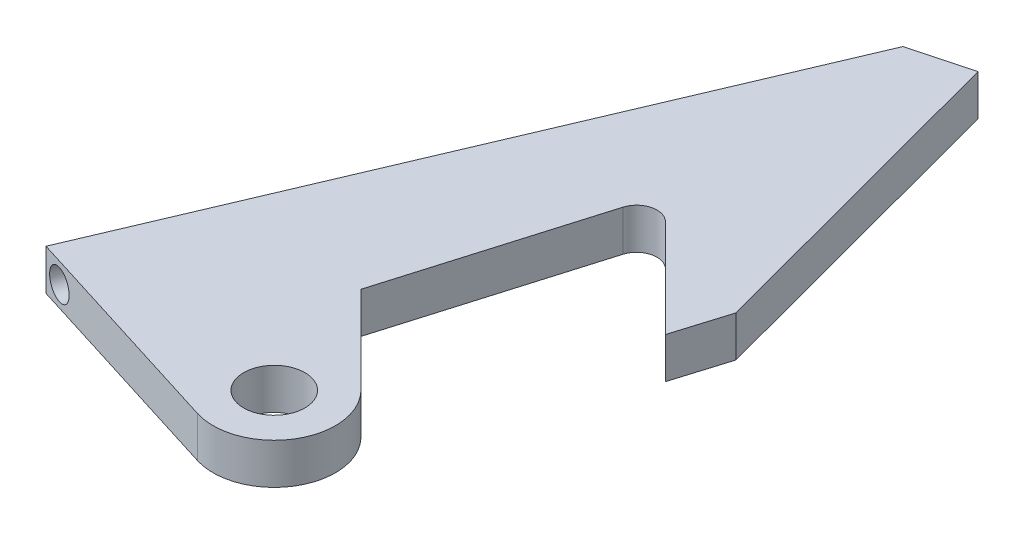
ISO-10303-21;
HEADER;
FILE_DESCRIPTION(('STEP AP214'),'2;1');
FILE_NAME('part.step','',(''),(''),'','','');
FILE_SCHEMA(('AUTOMOTIVE_DESIGN { 1 0 10303 214 1 1 1 1 }'));
ENDSEC;
DATA;
#1=APPLICATION_CONTEXT('core data for automotive mechanical design processes');
#2=APPLICATION_PROTOCOL_DEFINITION('international standard','automotive_design',2000,#1);
#3=PRODUCT_CONTEXT('',#1,'mechanical');
#4=PRODUCT('Part','Part','',(#3));
#5=PRODUCT_RELATED_PRODUCT_CATEGORY('part','',(#4));
#6=PRODUCT_DEFINITION_FORMATION('','',#4);
#7=PRODUCT_DEFINITION_CONTEXT('part definition',#1,'design');
#8=PRODUCT_DEFINITION('design','',#6,#7);
#9=PRODUCT_DEFINITION_SHAPE('','',#8);
#10=(LENGTH_UNIT() NAMED_UNIT(*) SI_UNIT(.MILLI.,.METRE.));
#11=(NAMED_UNIT(*) PLANE_ANGLE_UNIT() SI_UNIT($,.RADIAN.));
#12=(NAMED_UNIT(*) SI_UNIT($,.STERADIAN.) SOLID_ANGLE_UNIT());
#13=UNCERTAINTY_MEASURE_WITH_UNIT(LENGTH_MEASURE(1.E-05),#10,'distance_accuracy_value','');
#14=(GEOMETRIC_REPRESENTATION_CONTEXT(3) GLOBAL_UNCERTAINTY_ASSIGNED_CONTEXT((#13)) GLOBAL_UNIT_ASSIGNED_CONTEXT((#10,
#11,#12)) REPRESENTATION_CONTEXT('',''));
#15=CARTESIAN_POINT('',(0.,0.,0.));
#16=DIRECTION('',(0.,0.,1.));
#17=DIRECTION('',(1.,0.,0.));
#18=AXIS2_PLACEMENT_3D('',#15,#16,#17);
#19=CARTESIAN_POINT('',(-9.58336148505084,6.35,57.0523987186824));
#20=DIRECTION('',(0.,1.,0.));
#21=DIRECTION('',(0.,0.,1.));
#22=AXIS2_PLACEMENT_3D('',#19,#20,#21);
#23=PLANE('',#22);
#24=DIRECTION('',(0.292719197910584,0.,-0.956198447590553));
#25=VECTOR('',#24,1.);
#26=CARTESIAN_POINT('',(13.3155738088918,6.35,19.1289332993239));
#27=LINE('',#26,#25);
#28=CARTESIAN_POINT('',(13.3155738088918,6.35,19.1289332993239));
#29=VERTEX_POINT('',#28);
#30=CARTESIAN_POINT('',(15.8794716912915,6.35,10.7536876972908));
#31=VERTEX_POINT('',#30);
#32=EDGE_CURVE('E168',#29,#31,#27,.T.);
#33=ORIENTED_EDGE('',*,*,#32,.T.);
#34=DIRECTION('',(-0.25723629660689,0.,-0.96634853324666));
#35=VECTOR('',#34,1.);
#36=CARTESIAN_POINT('',(15.8794716912915,6.35,10.7536876972908));
#37=LINE('',#36,#35);
#38=CARTESIAN_POINT('',(2.2197595002291,6.35,-40.5611656671901));
#39=VERTEX_POINT('',#38);
#40=EDGE_CURVE('E105',#31,#39,#37,.T.);
#41=ORIENTED_EDGE('',*,*,#40,.T.);
#42=DIRECTION('',(-0.96634853324666,0.,0.257236296606892));
#43=VECTOR('',#42,1.);
#44=CARTESIAN_POINT('',(-6.99422582657964,6.35,-38.1084569591886));
#45=LINE('',#44,#43);
#46=CARTESIAN_POINT('',(-6.99422582657964,6.35,-38.1084569591886));
#47=VERTEX_POINT('',#46);
#48=EDGE_CURVE('E189',#39,#47,#45,.T.);
#49=ORIENTED_EDGE('',*,*,#48,.T.);
#50=DIRECTION('',(-0.391080688495198,0.,0.920356395689258));
#51=VECTOR('',#50,1.);
#52=CARTESIAN_POINT('',(-46.7280237776918,6.35,55.39975284284));
#53=LINE('',#52,#51);
#54=CARTESIAN_POINT('',(-46.7280237776918,6.35,55.39975284284));
#55=VERTEX_POINT('',#54);
#56=EDGE_CURVE('E208',#47,#55,#53,.T.);
#57=ORIENTED_EDGE('',*,*,#56,.T.);
#58=DIRECTION('',(0.954289276042193,0.,0.298884555691437));
#59=VECTOR('',#58,1.);
#60=CARTESIAN_POINT('',(-12.3815604695126,6.35,66.1571067010044));
#61=LINE('',#60,#59);
#62=CARTESIAN_POINT('',(-12.3815604695126,6.35,66.1571067010044));
#63=VERTEX_POINT('',#62);
#64=EDGE_CURVE('E205',#55,#63,#61,.T.);
#65=ORIENTED_EDGE('',*,*,#64,.T.);
#66=CARTESIAN_POINT('',(-9.58336148505084,6.35,57.0523987186824));
#67=DIRECTION('',(0.,1.,0.));
#68=DIRECTION('',(0.,0.,1.));
#69=AXIS2_PLACEMENT_3D('',#66,#67,#68);
#70=CIRCLE('',#69,9.525);
#71=CARTESIAN_POINT('',(-2.71547260344062,6.35,50.4525708944241));
#72=VERTEX_POINT('',#71);
#73=EDGE_CURVE('E207',#63,#72,#70,.T.);
#74=ORIENTED_EDGE('',*,*,#73,.T.);
#75=DIRECTION('',(-0.707038114572614,0.,-0.707175441132964));
#76=VECTOR('',#75,1.);
#77=CARTESIAN_POINT('',(-2.71547260344062,6.35,50.4525708944241));
#78=LINE('',#77,#76);
#79=CARTESIAN_POINT('',(-16.4492107059134,6.35,36.7161653162162));
#80=VERTEX_POINT('',#79);
#81=EDGE_CURVE('E131',#72,#80,#78,.T.);
#82=ORIENTED_EDGE('',*,*,#81,.T.);
#83=DIRECTION('',(0.284015344703923,0.,-0.958819734868193));
#84=VECTOR('',#83,1.);
#85=CARTESIAN_POINT('',(-7.14392939853329,6.35,5.30206209120496));
#86=LINE('',#85,#84);
#87=CARTESIAN_POINT('',(-7.14392939853329,6.35,5.30206209120496));
#88=VERTEX_POINT('',#87);
#89=EDGE_CURVE('E125',#80,#88,#86,.T.);
#90=ORIENTED_EDGE('',*,*,#89,.T.);
#91=CARTESIAN_POINT('',(-4.09967674032677,6.35,6.20381081063987));
#92=DIRECTION('',(0.,-1.,0.));
#93=DIRECTION('',(0.,0.,1.));
#94=AXIS2_PLACEMENT_3D('',#91,#92,#93);
#95=CIRCLE('',#94,3.175);
#96=CARTESIAN_POINT('',(-1.85461271005945,6.35,3.95874678037261));
#97=VERTEX_POINT('',#96);
#98=EDGE_CURVE('E129',#88,#97,#95,.T.);
#99=ORIENTED_EDGE('',*,*,#98,.T.);
#100=DIRECTION('',(0.707106781186547,0.,0.707106781186548));
#101=VECTOR('',#100,1.);
#102=CARTESIAN_POINT('',(13.3155738088918,6.35,19.1289332993239));
#103=LINE('',#102,#101);
#104=EDGE_CURVE('E55',#97,#29,#103,.T.);
#105=ORIENTED_EDGE('',*,*,#104,.T.);
#106=EDGE_LOOP('',(#33,#41,#49,#57,#65,#74,#82,#90,#99,#105));
#107=FACE_BOUND('',#106,.T.);
#108=CARTESIAN_POINT('',(-9.58336148505084,6.35,57.0523987186824));
#109=DIRECTION('',(0.,1.,0.));
#110=DIRECTION('',(0.,0.,1.));
#111=AXIS2_PLACEMENT_3D('',#108,#109,#110);
#112=CIRCLE('',#111,4.7625);
#113=CARTESIAN_POINT('',(-9.58336148505084,6.35,61.8148987186824));
#114=VERTEX_POINT('',#113);
#115=EDGE_CURVE('E153',#114,#114,#112,.T.);
#116=ORIENTED_EDGE('',*,*,#115,.F.);
#117=EDGE_LOOP('',(#116));
#118=FACE_BOUND('',#117,.T.);
#119=ADVANCED_FACE('F38',(#107,#118),#23,.T.);
#120=CARTESIAN_POINT('',(-9.58336148505084,0.,57.0523987186824));
#121=DIRECTION('',(0.,1.,0.));
#122=DIRECTION('',(0.,0.,1.));
#123=AXIS2_PLACEMENT_3D('',#120,#121,#122);
#124=PLANE('',#123);
#125=DIRECTION('',(0.292719197910584,0.,-0.956198447590553));
#126=VECTOR('',#125,1.);
#127=CARTESIAN_POINT('',(13.3155738088918,0.,19.1289332993239));
#128=LINE('',#127,#126);
#129=CARTESIAN_POINT('',(13.3155738088918,0.,19.1289332993239));
#130=VERTEX_POINT('',#129);
#131=CARTESIAN_POINT('',(15.8794716912915,0.,10.7536876972908));
#132=VERTEX_POINT('',#131);
#133=EDGE_CURVE('E149',#130,#132,#128,.T.);
#134=ORIENTED_EDGE('',*,*,#133,.F.);
#135=DIRECTION('',(0.707106781186547,0.,0.707106781186548));
#136=VECTOR('',#135,1.);
#137=CARTESIAN_POINT('',(13.3155738088918,0.,19.1289332993239));
#138=LINE('',#137,#136);
#139=CARTESIAN_POINT('',(-1.85461271005945,0.,3.95874678037261));
#140=VERTEX_POINT('',#139);
#141=EDGE_CURVE('E97',#140,#130,#138,.T.);
#142=ORIENTED_EDGE('',*,*,#141,.F.);
#143=CARTESIAN_POINT('',(-4.09967674032677,0.,6.20381081063987));
#144=DIRECTION('',(0.,-1.,0.));
#145=DIRECTION('',(0.,0.,1.));
#146=AXIS2_PLACEMENT_3D('',#143,#144,#145);
#147=CIRCLE('',#146,3.175);
#148=CARTESIAN_POINT('',(-7.14392939853329,0.,5.30206209120496));
#149=VERTEX_POINT('',#148);
#150=EDGE_CURVE('E91',#149,#140,#147,.T.);
#151=ORIENTED_EDGE('',*,*,#150,.F.);
#152=DIRECTION('',(0.284015344703923,0.,-0.958819734868193));
#153=VECTOR('',#152,1.);
#154=CARTESIAN_POINT('',(-7.14392939853329,0.,5.30206209120496));
#155=LINE('',#154,#153);
#156=CARTESIAN_POINT('',(-16.4492107059134,0.,36.7161653162162));
#157=VERTEX_POINT('',#156);
#158=EDGE_CURVE('E139',#157,#149,#155,.T.);
#159=ORIENTED_EDGE('',*,*,#158,.F.);
#160=DIRECTION('',(-0.707038114572614,0.,-0.707175441132964));
#161=VECTOR('',#160,1.);
#162=CARTESIAN_POINT('',(-2.71547260344062,0.,50.4525708944241));
#163=LINE('',#162,#161);
#164=CARTESIAN_POINT('',(-2.71547260344062,0.,50.4525708944241));
#165=VERTEX_POINT('',#164);
#166=EDGE_CURVE('E163',#165,#157,#163,.T.);
#167=ORIENTED_EDGE('',*,*,#166,.F.);
#168=CARTESIAN_POINT('',(-9.58336148505084,0.,57.0523987186824));
#169=DIRECTION('',(0.,1.,0.));
#170=DIRECTION('',(0.,0.,1.));
#171=AXIS2_PLACEMENT_3D('',#168,#169,#170);
#172=CIRCLE('',#171,9.525);
#173=CARTESIAN_POINT('',(-12.3815604695126,0.,66.1571067010044));
#174=VERTEX_POINT('',#173);
#175=EDGE_CURVE('E161',#174,#165,#172,.T.);
#176=ORIENTED_EDGE('',*,*,#175,.F.);
#177=DIRECTION('',(0.954289276042193,0.,0.298884555691437));
#178=VECTOR('',#177,1.);
#179=CARTESIAN_POINT('',(-12.3815604695126,0.,66.1571067010044));
#180=LINE('',#179,#178);
#181=CARTESIAN_POINT('',(-46.7280237776918,0.,55.39975284284));
#182=VERTEX_POINT('',#181);
#183=EDGE_CURVE('E159',#182,#174,#180,.T.);
#184=ORIENTED_EDGE('',*,*,#183,.F.);
#185=DIRECTION('',(-0.391080688495198,0.,0.920356395689258));
#186=VECTOR('',#185,1.);
#187=CARTESIAN_POINT('',(-46.7280237776918,0.,55.39975284284));
#188=LINE('',#187,#186);
#189=CARTESIAN_POINT('',(-6.99422582657964,0.,-38.1084569591886));
#190=VERTEX_POINT('',#189);
#191=EDGE_CURVE('E157',#190,#182,#188,.T.);
#192=ORIENTED_EDGE('',*,*,#191,.F.);
#193=DIRECTION('',(-0.96634853324666,0.,0.257236296606892));
#194=VECTOR('',#193,1.);
#195=CARTESIAN_POINT('',(-6.99422582657964,0.,-38.1084569591886));
#196=LINE('',#195,#194);
#197=CARTESIAN_POINT('',(2.2197595002291,0.,-40.5611656671901));
#198=VERTEX_POINT('',#197);
#199=EDGE_CURVE('E155',#198,#190,#196,.T.);
#200=ORIENTED_EDGE('',*,*,#199,.F.);
#201=DIRECTION('',(-0.25723629660689,0.,-0.96634853324666));
#202=VECTOR('',#201,1.);
#203=CARTESIAN_POINT('',(15.8794716912915,0.,10.7536876972908));
#204=LINE('',#203,#202);
#205=EDGE_CURVE('E152',#132,#198,#204,.T.);
#206=ORIENTED_EDGE('',*,*,#205,.F.);
#207=EDGE_LOOP('',(#134,#142,#151,#159,#167,#176,#184,#192,#200,#206));
#208=FACE_BOUND('',#207,.T.);
#209=CARTESIAN_POINT('',(-9.58336148505084,0.,57.0523987186824));
#210=DIRECTION('',(0.,1.,0.));
#211=DIRECTION('',(0.,0.,1.));
#212=AXIS2_PLACEMENT_3D('',#209,#210,#211);
#213=CIRCLE('',#212,4.7625);
#214=CARTESIAN_POINT('',(-9.58336148505084,0.,61.8148987186824));
#215=VERTEX_POINT('',#214);
#216=EDGE_CURVE('E216',#215,#215,#213,.T.);
#217=ORIENTED_EDGE('',*,*,#216,.T.);
#218=EDGE_LOOP('',(#217));
#219=FACE_BOUND('',#218,.T.);
#220=ADVANCED_FACE('F193',(#208,#219),#124,.F.);
#221=CARTESIAN_POINT('',(13.3155738088918,6.35,19.1289332993239));
#222=DIRECTION('',(-0.956198447590553,0.,-0.292719197910584));
#223=DIRECTION('',(-0.292719197910584,0.,0.956198447590554));
#224=AXIS2_PLACEMENT_3D('',#221,#222,#223);
#225=PLANE('',#224);
#226=ORIENTED_EDGE('',*,*,#133,.T.);
#227=DIRECTION('',(0.,-1.,0.));
#228=VECTOR('',#227,1.);
#229=CARTESIAN_POINT('',(15.8794716912915,6.35,10.7536876972908));
#230=LINE('',#229,#228);
#231=EDGE_CURVE('E11',#31,#132,#230,.T.);
#232=ORIENTED_EDGE('',*,*,#231,.F.);
#233=ORIENTED_EDGE('',*,*,#32,.F.);
#234=DIRECTION('',(0.,-1.,0.));
#235=VECTOR('',#234,1.);
#236=CARTESIAN_POINT('',(13.3155738088918,6.35,19.1289332993239));
#237=LINE('',#236,#235);
#238=EDGE_CURVE('E145',#29,#130,#237,.T.);
#239=ORIENTED_EDGE('',*,*,#238,.T.);
#240=EDGE_LOOP('',(#226,#232,#233,#239));
#241=FACE_BOUND('',#240,.T.);
#242=ADVANCED_FACE('F40',(#241),#225,.F.);
#243=CARTESIAN_POINT('',(15.8794716912915,6.35,10.7536876972908));
#244=DIRECTION('',(-0.966348533246661,0.,0.25723629660689));
#245=DIRECTION('',(0.25723629660689,0.,0.966348533246661));
#246=AXIS2_PLACEMENT_3D('',#243,#244,#245);
#247=PLANE('',#246);
#248=ORIENTED_EDGE('',*,*,#205,.T.);
#249=DIRECTION('',(0.,-1.,0.));
#250=VECTOR('',#249,1.);
#251=CARTESIAN_POINT('',(2.2197595002291,6.35,-40.5611656671901));
#252=LINE('',#251,#250);
#253=EDGE_CURVE('E47',#39,#198,#252,.T.);
#254=ORIENTED_EDGE('',*,*,#253,.F.);
#255=ORIENTED_EDGE('',*,*,#40,.F.);
#256=ORIENTED_EDGE('',*,*,#231,.T.);
#257=EDGE_LOOP('',(#248,#254,#255,#256));
#258=FACE_BOUND('',#257,.T.);
#259=ADVANCED_FACE('F267',(#258),#247,.F.);
#260=CARTESIAN_POINT('',(-6.99422582657964,6.35,-38.1084569591886));
#261=DIRECTION('',(0.257236296606892,0.,0.96634853324666));
#262=DIRECTION('',(0.96634853324666,0.,-0.257236296606892));
#263=AXIS2_PLACEMENT_3D('',#260,#261,#262);
#264=PLANE('',#263);
#265=ORIENTED_EDGE('',*,*,#199,.T.);
#266=DIRECTION('',(0.,-1.,0.));
#267=VECTOR('',#266,1.);
#268=CARTESIAN_POINT('',(-6.99422582657964,6.35,-38.1084569591886));
#269=LINE('',#268,#267);
#270=EDGE_CURVE('E181',#47,#190,#269,.T.);
#271=ORIENTED_EDGE('',*,*,#270,.F.);
#272=ORIENTED_EDGE('',*,*,#48,.F.);
#273=ORIENTED_EDGE('',*,*,#253,.T.);
#274=EDGE_LOOP('',(#265,#271,#272,#273));
#275=FACE_BOUND('',#274,.T.);
#276=ADVANCED_FACE('F187',(#275),#264,.F.);
#277=CARTESIAN_POINT('',(-46.7280237776918,6.35,55.39975284284));
#278=DIRECTION('',(0.920356395689258,0.,0.391080688495198));
#279=DIRECTION('',(0.391080688495198,0.,-0.920356395689258));
#280=AXIS2_PLACEMENT_3D('',#277,#278,#279);
#281=PLANE('',#280);
#282=ORIENTED_EDGE('',*,*,#191,.T.);
#283=DIRECTION('',(0.,-1.,0.));
#284=VECTOR('',#283,1.);
#285=CARTESIAN_POINT('',(-46.7280237776918,6.35,55.39975284284));
#286=LINE('',#285,#284);
#287=EDGE_CURVE('E178',#55,#182,#286,.T.);
#288=ORIENTED_EDGE('',*,*,#287,.F.);
#289=ORIENTED_EDGE('',*,*,#56,.F.);
#290=ORIENTED_EDGE('',*,*,#270,.T.);
#291=EDGE_LOOP('',(#282,#288,#289,#290));
#292=FACE_BOUND('',#291,.T.);
#293=ADVANCED_FACE('F199',(#292),#281,.F.);
#294=CARTESIAN_POINT('',(-12.3815604695126,6.35,66.1571067010044));
#295=DIRECTION('',(0.298884555691437,0.,-0.954289276042193));
#296=DIRECTION('',(-0.954289276042193,0.,-0.298884555691437));
#297=AXIS2_PLACEMENT_3D('',#294,#295,#296);
#298=PLANE('',#297);
#299=CARTESIAN_POINT('',(-43.6981553262578,3.175,56.3487113071603));
#300=DIRECTION('',(-0.298884555691437,0.,0.954289276042193));
#301=DIRECTION('',(0.954289276042193,0.,0.298884555691437));
#302=AXIS2_PLACEMENT_3D('',#299,#300,#301);
#303=CIRCLE('',#302,2.3114);
#304=CARTESIAN_POINT('',(-41.4924110936139,3.175,57.0395530691855));
#305=VERTEX_POINT('',#304);
#306=EDGE_CURVE('E224',#305,#305,#303,.T.);
#307=ORIENTED_EDGE('',*,*,#306,.F.);
#308=EDGE_LOOP('',(#307));
#309=FACE_BOUND('',#308,.T.);
#310=ORIENTED_EDGE('',*,*,#183,.T.);
#311=DIRECTION('',(0.,-1.,0.));
#312=VECTOR('',#311,1.);
#313=CARTESIAN_POINT('',(-12.3815604695126,6.35,66.1571067010044));
#314=LINE('',#313,#312);
#315=EDGE_CURVE('E175',#63,#174,#314,.T.);
#316=ORIENTED_EDGE('',*,*,#315,.F.);
#317=ORIENTED_EDGE('',*,*,#64,.F.);
#318=ORIENTED_EDGE('',*,*,#287,.T.);
#319=EDGE_LOOP('',(#310,#316,#317,#318));
#320=FACE_BOUND('',#319,.T.);
#321=ADVANCED_FACE('F203',(#309,#320),#298,.F.);
#322=CARTESIAN_POINT('',(-9.58336148505084,6.35,57.0523987186824));
#323=DIRECTION('',(0.,-1.,0.));
#324=DIRECTION('',(0.,0.,-1.));
#325=AXIS2_PLACEMENT_3D('',#322,#323,#324);
#326=CYLINDRICAL_SURFACE('',#325,9.525);
#327=ORIENTED_EDGE('',*,*,#175,.T.);
#328=DIRECTION('',(0.,-1.,0.));
#329=VECTOR('',#328,1.);
#330=CARTESIAN_POINT('',(-2.71547260344062,6.35,50.4525708944241));
#331=LINE('',#330,#329);
#332=EDGE_CURVE('E172',#72,#165,#331,.T.);
#333=ORIENTED_EDGE('',*,*,#332,.F.);
#334=ORIENTED_EDGE('',*,*,#73,.F.);
#335=ORIENTED_EDGE('',*,*,#315,.T.);
#336=EDGE_LOOP('',(#327,#333,#334,#335));
#337=FACE_BOUND('',#336,.T.);
#338=ADVANCED_FACE('F231',(#337),#326,.T.);
#339=CARTESIAN_POINT('',(-2.71547260344062,6.35,50.4525708944241));
#340=DIRECTION('',(-0.707175441132964,0.,0.707038114572614));
#341=DIRECTION('',(0.707038114572614,0.,0.707175441132964));
#342=AXIS2_PLACEMENT_3D('',#339,#340,#341);
#343=PLANE('',#342);
#344=ORIENTED_EDGE('',*,*,#166,.T.);
#345=DIRECTION('',(0.,-1.,0.));
#346=VECTOR('',#345,1.);
#347=CARTESIAN_POINT('',(-16.4492107059134,6.35,36.7161653162162));
#348=LINE('',#347,#346);
#349=EDGE_CURVE('E140',#80,#157,#348,.T.);
#350=ORIENTED_EDGE('',*,*,#349,.F.);
#351=ORIENTED_EDGE('',*,*,#81,.F.);
#352=ORIENTED_EDGE('',*,*,#332,.T.);
#353=EDGE_LOOP('',(#344,#350,#351,#352));
#354=FACE_BOUND('',#353,.T.);
#355=ADVANCED_FACE('F237',(#354),#343,.F.);
#356=CARTESIAN_POINT('',(-7.14392939853329,6.35,5.30206209120496));
#357=DIRECTION('',(-0.958819734868193,0.,-0.284015344703923));
#358=DIRECTION('',(-0.284015344703923,0.,0.958819734868193));
#359=AXIS2_PLACEMENT_3D('',#356,#357,#358);
#360=PLANE('',#359);
#361=ORIENTED_EDGE('',*,*,#158,.T.);
#362=DIRECTION('',(0.,-1.,0.));
#363=VECTOR('',#362,1.);
#364=CARTESIAN_POINT('',(-7.14392939853329,6.35,5.30206209120496));
#365=LINE('',#364,#363);
#366=EDGE_CURVE('E136',#88,#149,#365,.T.);
#367=ORIENTED_EDGE('',*,*,#366,.F.);
#368=ORIENTED_EDGE('',*,*,#89,.F.);
#369=ORIENTED_EDGE('',*,*,#349,.T.);
#370=EDGE_LOOP('',(#361,#367,#368,#369));
#371=FACE_BOUND('',#370,.T.);
#372=ADVANCED_FACE('F137',(#371),#360,.F.);
#373=CARTESIAN_POINT('',(-4.09967674032677,6.35,6.20381081063987));
#374=DIRECTION('',(0.,-1.,0.));
#375=DIRECTION('',(0.,0.,-1.));
#376=AXIS2_PLACEMENT_3D('',#373,#374,#375);
#377=CYLINDRICAL_SURFACE('',#376,3.175);
#378=ORIENTED_EDGE('',*,*,#150,.T.);
#379=DIRECTION('',(0.,-1.,0.));
#380=VECTOR('',#379,1.);
#381=CARTESIAN_POINT('',(-1.85461271005945,6.35,3.95874678037261));
#382=LINE('',#381,#380);
#383=EDGE_CURVE('E141',#97,#140,#382,.T.);
#384=ORIENTED_EDGE('',*,*,#383,.F.);
#385=ORIENTED_EDGE('',*,*,#98,.F.);
#386=ORIENTED_EDGE('',*,*,#366,.T.);
#387=EDGE_LOOP('',(#378,#384,#385,#386));
#388=FACE_BOUND('',#387,.T.);
#389=ADVANCED_FACE('F143',(#388),#377,.F.);
#390=CARTESIAN_POINT('',(13.3155738088918,6.35,19.1289332993239));
#391=DIRECTION('',(0.707106781186548,0.,-0.707106781186547));
#392=DIRECTION('',(-0.707106781186547,0.,-0.707106781186548));
#393=AXIS2_PLACEMENT_3D('',#390,#391,#392);
#394=PLANE('',#393);
#395=ORIENTED_EDGE('',*,*,#141,.T.);
#396=ORIENTED_EDGE('',*,*,#238,.F.);
#397=ORIENTED_EDGE('',*,*,#104,.F.);
#398=ORIENTED_EDGE('',*,*,#383,.T.);
#399=EDGE_LOOP('',(#395,#396,#397,#398));
#400=FACE_BOUND('',#399,.T.);
#401=ADVANCED_FACE('F251',(#400),#394,.F.);
#402=CARTESIAN_POINT('',(-9.58336148505084,6.35,57.0523987186824));
#403=DIRECTION('',(0.,-1.,0.));
#404=DIRECTION('',(0.,0.,-1.));
#405=AXIS2_PLACEMENT_3D('',#402,#403,#404);
#406=CYLINDRICAL_SURFACE('',#405,4.7625);
#407=ORIENTED_EDGE('',*,*,#115,.T.);
#408=EDGE_LOOP('',(#407));
#409=FACE_BOUND('',#408,.T.);
#410=ORIENTED_EDGE('',*,*,#216,.F.);
#411=EDGE_LOOP('',(#410));
#412=FACE_BOUND('',#411,.T.);
#413=ADVANCED_FACE('F248',(#409,#412),#406,.F.);
#414=CARTESIAN_POINT('',(-41.8002383976172,3.175,50.2889744042924));
#415=DIRECTION('',(-0.298884555691437,0.,0.954289276042193));
#416=DIRECTION('',(0.954289276042193,0.,0.298884555691437));
#417=AXIS2_PLACEMENT_3D('',#414,#415,#416);
#418=CONICAL_SURFACE('',#417,2.3114,1.02974425867665);
#419=CARTESIAN_POINT('',(-41.3851387888366,3.175,48.9636295592495));
#420=VERTEX_POINT('',#419);
#421=VERTEX_LOOP('',#420);
#422=FACE_BOUND('',#421,.T.);
#423=CARTESIAN_POINT('',(-41.8002383976172,3.175,50.2889744042924));
#424=DIRECTION('',(-0.298884555691437,0.,0.954289276042193));
#425=DIRECTION('',(0.954289276042193,0.,0.298884555691437));
#426=AXIS2_PLACEMENT_3D('',#423,#424,#425);
#427=CIRCLE('',#426,2.3114);
#428=CARTESIAN_POINT('',(-39.5944941649733,3.175,50.9798161663176));
#429=VERTEX_POINT('',#428);
#430=EDGE_CURVE('E219',#429,#429,#427,.T.);
#431=ORIENTED_EDGE('',*,*,#430,.T.);
#432=EDGE_LOOP('',(#431));
#433=FACE_BOUND('',#432,.T.);
#434=ADVANCED_FACE('F352',(#422,#433),#418,.F.);
#435=CARTESIAN_POINT('',(-43.6981553262578,3.175,56.3487113071603));
#436=DIRECTION('',(-0.298884555691437,0.,0.954289276042193));
#437=DIRECTION('',(0.954289276042193,0.,0.298884555691437));
#438=AXIS2_PLACEMENT_3D('',#435,#436,#437);
#439=CYLINDRICAL_SURFACE('',#438,2.3114);
#440=ORIENTED_EDGE('',*,*,#430,.F.);
#441=EDGE_LOOP('',(#440));
#442=FACE_BOUND('',#441,.T.);
#443=ORIENTED_EDGE('',*,*,#306,.T.);
#444=EDGE_LOOP('',(#443));
#445=FACE_BOUND('',#444,.T.);
#446=ADVANCED_FACE('F228',(#442,#445),#439,.F.);
#447=CLOSED_SHELL('',(#119,#220,#242,#259,#276,#293,#321,#338,#355,#372,#389,#401,#413,#434,#446));
#448=MANIFOLD_SOLID_BREP('B2',#447);
#449=ADVANCED_BREP_SHAPE_REPRESENTATION('',(#18,#448),#14);
#450=SHAPE_DEFINITION_REPRESENTATION(#9,#449);
ENDSEC;
END-ISO-10303-21;
